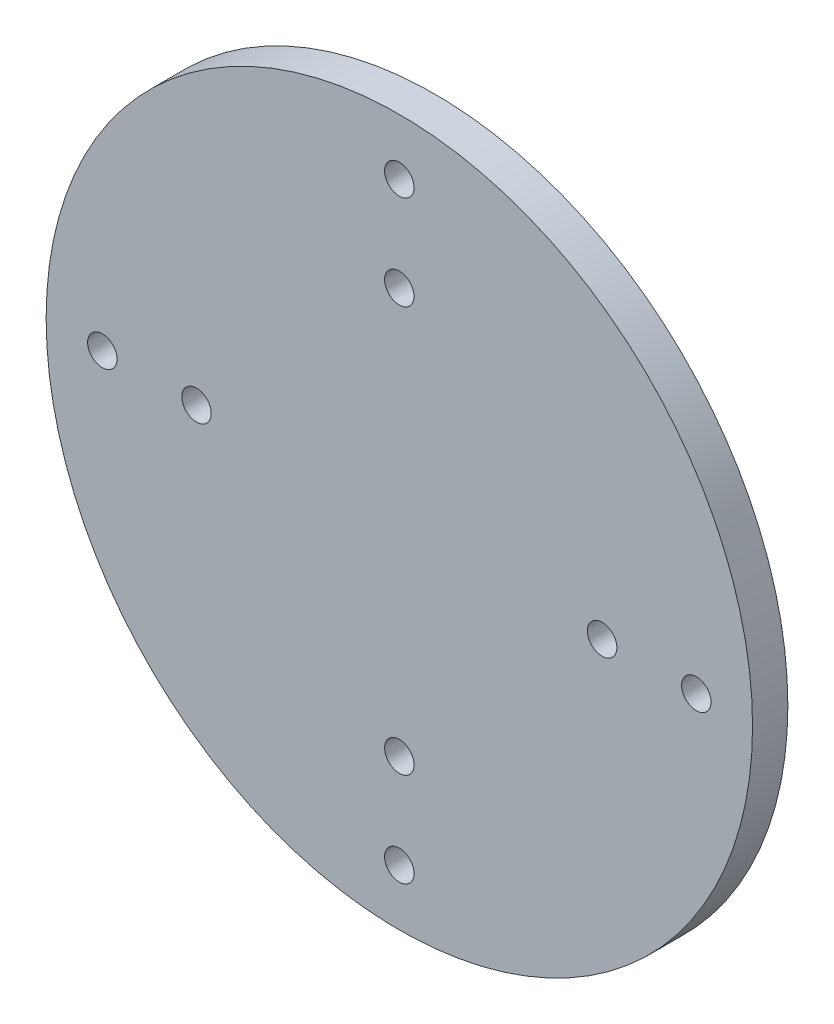
ISO-10303-21;
HEADER;
FILE_DESCRIPTION(('STEP AP214'),'2;1');
FILE_NAME('part.step','',(''),(''),'','','');
FILE_SCHEMA(('AUTOMOTIVE_DESIGN { 1 0 10303 214 1 1 1 1 }'));
ENDSEC;
DATA;
#1=APPLICATION_CONTEXT('core data for automotive mechanical design processes');
#2=APPLICATION_PROTOCOL_DEFINITION('international standard','automotive_design',2000,#1);
#3=PRODUCT_CONTEXT('',#1,'mechanical');
#4=PRODUCT('Part','Part','',(#3));
#5=PRODUCT_RELATED_PRODUCT_CATEGORY('part','',(#4));
#6=PRODUCT_DEFINITION_FORMATION('','',#4);
#7=PRODUCT_DEFINITION_CONTEXT('part definition',#1,'design');
#8=PRODUCT_DEFINITION('design','',#6,#7);
#9=PRODUCT_DEFINITION_SHAPE('','',#8);
#10=(LENGTH_UNIT() NAMED_UNIT(*) SI_UNIT(.MILLI.,.METRE.));
#11=(NAMED_UNIT(*) PLANE_ANGLE_UNIT() SI_UNIT($,.RADIAN.));
#12=(NAMED_UNIT(*) SI_UNIT($,.STERADIAN.) SOLID_ANGLE_UNIT());
#13=UNCERTAINTY_MEASURE_WITH_UNIT(LENGTH_MEASURE(1.E-05),#10,'distance_accuracy_value','');
#14=(GEOMETRIC_REPRESENTATION_CONTEXT(3) GLOBAL_UNCERTAINTY_ASSIGNED_CONTEXT((#13)) GLOBAL_UNIT_ASSIGNED_CONTEXT((#10,
#11,#12)) REPRESENTATION_CONTEXT('',''));
#15=CARTESIAN_POINT('',(0.,0.,0.));
#16=DIRECTION('',(0.,0.,1.));
#17=DIRECTION('',(1.,0.,0.));
#18=AXIS2_PLACEMENT_3D('',#15,#16,#17);
#19=CARTESIAN_POINT('',(124.757462075776,5.,0.));
#20=DIRECTION('',(0.,0.,1.));
#21=DIRECTION('',(1.,0.,0.));
#22=AXIS2_PLACEMENT_3D('',#19,#20,#21);
#23=PLANE('',#22);
#24=CARTESIAN_POINT('',(124.757462075775,-12.2246272896273,0.));
#25=DIRECTION('',(0.,0.,-1.));
#26=DIRECTION('',(-1.,0.,0.));
#27=AXIS2_PLACEMENT_3D('',#24,#25,#26);
#28=CIRCLE('',#27,1.25);
#29=CARTESIAN_POINT('',(123.507462075775,-12.2246272896273,0.));
#30=VERTEX_POINT('',#29);
#31=EDGE_CURVE('E84',#30,#30,#28,.T.);
#32=ORIENTED_EDGE('',*,*,#31,.F.);
#33=EDGE_LOOP('',(#32));
#34=FACE_BOUND('',#33,.T.);
#35=CARTESIAN_POINT('',(149.982089365403,4.99999999999999,0.));
#36=DIRECTION('',(0.,0.,-1.));
#37=DIRECTION('',(-1.,0.,0.));
#38=AXIS2_PLACEMENT_3D('',#35,#36,#37);
#39=CIRCLE('',#38,1.25);
#40=CARTESIAN_POINT('',(148.732089365403,4.99999999999999,0.));
#41=VERTEX_POINT('',#40);
#42=EDGE_CURVE('E78',#41,#41,#39,.T.);
#43=ORIENTED_EDGE('',*,*,#42,.F.);
#44=EDGE_LOOP('',(#43));
#45=FACE_BOUND('',#44,.T.);
#46=CARTESIAN_POINT('',(141.982089365403,4.99999999999999,0.));
#47=DIRECTION('',(0.,0.,-1.));
#48=DIRECTION('',(-1.,0.,0.));
#49=AXIS2_PLACEMENT_3D('',#46,#47,#48);
#50=CIRCLE('',#49,1.25);
#51=CARTESIAN_POINT('',(140.732089365403,4.99999999999999,0.));
#52=VERTEX_POINT('',#51);
#53=EDGE_CURVE('E72',#52,#52,#50,.T.);
#54=ORIENTED_EDGE('',*,*,#53,.F.);
#55=EDGE_LOOP('',(#54));
#56=FACE_BOUND('',#55,.T.);
#57=CARTESIAN_POINT('',(124.757462075776,30.2246272896273,0.));
#58=DIRECTION('',(0.,0.,-1.));
#59=DIRECTION('',(-1.,0.,0.));
#60=AXIS2_PLACEMENT_3D('',#57,#58,#59);
#61=CIRCLE('',#60,1.24999999999999);
#62=CARTESIAN_POINT('',(123.507462075776,30.2246272896273,0.));
#63=VERTEX_POINT('',#62);
#64=EDGE_CURVE('E66',#63,#63,#61,.T.);
#65=ORIENTED_EDGE('',*,*,#64,.F.);
#66=EDGE_LOOP('',(#65));
#67=FACE_BOUND('',#66,.T.);
#68=CARTESIAN_POINT('',(124.757462075776,22.2246272896273,0.));
#69=DIRECTION('',(0.,0.,-1.));
#70=DIRECTION('',(-1.,0.,0.));
#71=AXIS2_PLACEMENT_3D('',#68,#69,#70);
#72=CIRCLE('',#71,1.24999999999999);
#73=CARTESIAN_POINT('',(123.507462075776,22.2246272896273,0.));
#74=VERTEX_POINT('',#73);
#75=EDGE_CURVE('E60',#74,#74,#72,.T.);
#76=ORIENTED_EDGE('',*,*,#75,.F.);
#77=EDGE_LOOP('',(#76));
#78=FACE_BOUND('',#77,.T.);
#79=CARTESIAN_POINT('',(124.757462075776,5.,0.));
#80=DIRECTION('',(0.,0.,1.));
#81=DIRECTION('',(1.,0.,0.));
#82=AXIS2_PLACEMENT_3D('',#79,#80,#81);
#83=CIRCLE('',#82,30.);
#84=CARTESIAN_POINT('',(154.757462075776,5.,0.));
#85=VERTEX_POINT('',#84);
#86=EDGE_CURVE('E37',#85,#85,#83,.T.);
#87=ORIENTED_EDGE('',*,*,#86,.F.);
#88=EDGE_LOOP('',(#87));
#89=FACE_BOUND('',#88,.T.);
#90=CARTESIAN_POINT('',(107.532834786148,5.,0.));
#91=DIRECTION('',(0.,0.,-1.));
#92=DIRECTION('',(-1.,0.,0.));
#93=AXIS2_PLACEMENT_3D('',#90,#91,#92);
#94=CIRCLE('',#93,1.24999999999999);
#95=CARTESIAN_POINT('',(106.282834786148,5.,0.));
#96=VERTEX_POINT('',#95);
#97=EDGE_CURVE('E48',#96,#96,#94,.T.);
#98=ORIENTED_EDGE('',*,*,#97,.F.);
#99=EDGE_LOOP('',(#98));
#100=FACE_BOUND('',#99,.T.);
#101=CARTESIAN_POINT('',(99.5328347861484,5.,0.));
#102=DIRECTION('',(0.,0.,-1.));
#103=DIRECTION('',(-1.,0.,0.));
#104=AXIS2_PLACEMENT_3D('',#101,#102,#103);
#105=CIRCLE('',#104,1.24999999999999);
#106=CARTESIAN_POINT('',(98.2828347861484,5.,0.));
#107=VERTEX_POINT('',#106);
#108=EDGE_CURVE('E54',#107,#107,#105,.T.);
#109=ORIENTED_EDGE('',*,*,#108,.F.);
#110=EDGE_LOOP('',(#109));
#111=FACE_BOUND('',#110,.T.);
#112=CARTESIAN_POINT('',(124.757462075775,-20.2246272896273,0.));
#113=DIRECTION('',(0.,0.,-1.));
#114=DIRECTION('',(-1.,0.,0.));
#115=AXIS2_PLACEMENT_3D('',#112,#113,#114);
#116=CIRCLE('',#115,1.25);
#117=CARTESIAN_POINT('',(123.507462075775,-20.2246272896273,0.));
#118=VERTEX_POINT('',#117);
#119=EDGE_CURVE('E90',#118,#118,#116,.T.);
#120=ORIENTED_EDGE('',*,*,#119,.F.);
#121=EDGE_LOOP('',(#120));
#122=FACE_BOUND('',#121,.T.);
#123=ADVANCED_FACE('F33',(#34,#45,#56,#67,#78,#89,#100,#111,#122),#23,.F.);
#124=CARTESIAN_POINT('',(124.757462075776,5.,3.));
#125=DIRECTION('',(0.,0.,-1.));
#126=DIRECTION('',(-1.,0.,0.));
#127=AXIS2_PLACEMENT_3D('',#124,#125,#126);
#128=CYLINDRICAL_SURFACE('',#127,30.);
#129=CARTESIAN_POINT('',(124.757462075776,5.,3.));
#130=DIRECTION('',(0.,0.,1.));
#131=DIRECTION('',(1.,0.,0.));
#132=AXIS2_PLACEMENT_3D('',#129,#130,#131);
#133=CIRCLE('',#132,30.);
#134=CARTESIAN_POINT('',(154.757462075776,5.,3.));
#135=VERTEX_POINT('',#134);
#136=EDGE_CURVE('E10',#135,#135,#133,.T.);
#137=ORIENTED_EDGE('',*,*,#136,.F.);
#138=EDGE_LOOP('',(#137));
#139=FACE_BOUND('',#138,.T.);
#140=ORIENTED_EDGE('',*,*,#86,.T.);
#141=EDGE_LOOP('',(#140));
#142=FACE_BOUND('',#141,.T.);
#143=ADVANCED_FACE('F35',(#139,#142),#128,.T.);
#144=CARTESIAN_POINT('',(124.757462075776,5.,3.));
#145=DIRECTION('',(0.,0.,1.));
#146=DIRECTION('',(1.,0.,0.));
#147=AXIS2_PLACEMENT_3D('',#144,#145,#146);
#148=PLANE('',#147);
#149=CARTESIAN_POINT('',(124.757462075775,-20.2246272896273,3.));
#150=DIRECTION('',(0.,0.,1.));
#151=DIRECTION('',(1.,0.,0.));
#152=AXIS2_PLACEMENT_3D('',#149,#150,#151);
#153=CIRCLE('',#152,1.25);
#154=CARTESIAN_POINT('',(126.007462075775,-20.2246272896273,3.));
#155=VERTEX_POINT('',#154);
#156=EDGE_CURVE('E87',#155,#155,#153,.T.);
#157=ORIENTED_EDGE('',*,*,#156,.F.);
#158=EDGE_LOOP('',(#157));
#159=FACE_BOUND('',#158,.T.);
#160=CARTESIAN_POINT('',(124.757462075775,-12.2246272896273,3.));
#161=DIRECTION('',(0.,0.,1.));
#162=DIRECTION('',(1.,0.,0.));
#163=AXIS2_PLACEMENT_3D('',#160,#161,#162);
#164=CIRCLE('',#163,1.25);
#165=CARTESIAN_POINT('',(126.007462075775,-12.2246272896273,3.));
#166=VERTEX_POINT('',#165);
#167=EDGE_CURVE('E81',#166,#166,#164,.T.);
#168=ORIENTED_EDGE('',*,*,#167,.F.);
#169=EDGE_LOOP('',(#168));
#170=FACE_BOUND('',#169,.T.);
#171=CARTESIAN_POINT('',(149.982089365403,4.99999999999999,3.));
#172=DIRECTION('',(0.,0.,1.));
#173=DIRECTION('',(1.,0.,0.));
#174=AXIS2_PLACEMENT_3D('',#171,#172,#173);
#175=CIRCLE('',#174,1.25);
#176=CARTESIAN_POINT('',(151.232089365403,4.99999999999999,3.));
#177=VERTEX_POINT('',#176);
#178=EDGE_CURVE('E75',#177,#177,#175,.T.);
#179=ORIENTED_EDGE('',*,*,#178,.F.);
#180=EDGE_LOOP('',(#179));
#181=FACE_BOUND('',#180,.T.);
#182=CARTESIAN_POINT('',(141.982089365403,4.99999999999999,3.));
#183=DIRECTION('',(0.,0.,1.));
#184=DIRECTION('',(1.,0.,0.));
#185=AXIS2_PLACEMENT_3D('',#182,#183,#184);
#186=CIRCLE('',#185,1.25);
#187=CARTESIAN_POINT('',(143.232089365403,4.99999999999999,3.));
#188=VERTEX_POINT('',#187);
#189=EDGE_CURVE('E69',#188,#188,#186,.T.);
#190=ORIENTED_EDGE('',*,*,#189,.F.);
#191=EDGE_LOOP('',(#190));
#192=FACE_BOUND('',#191,.T.);
#193=CARTESIAN_POINT('',(124.757462075776,30.2246272896273,3.));
#194=DIRECTION('',(0.,0.,1.));
#195=DIRECTION('',(1.,0.,0.));
#196=AXIS2_PLACEMENT_3D('',#193,#194,#195);
#197=CIRCLE('',#196,1.24999999999999);
#198=CARTESIAN_POINT('',(126.007462075776,30.2246272896273,3.));
#199=VERTEX_POINT('',#198);
#200=EDGE_CURVE('E63',#199,#199,#197,.T.);
#201=ORIENTED_EDGE('',*,*,#200,.F.);
#202=EDGE_LOOP('',(#201));
#203=FACE_BOUND('',#202,.T.);
#204=CARTESIAN_POINT('',(124.757462075776,22.2246272896273,3.));
#205=DIRECTION('',(0.,0.,1.));
#206=DIRECTION('',(1.,0.,0.));
#207=AXIS2_PLACEMENT_3D('',#204,#205,#206);
#208=CIRCLE('',#207,1.24999999999999);
#209=CARTESIAN_POINT('',(126.007462075776,22.2246272896273,3.));
#210=VERTEX_POINT('',#209);
#211=EDGE_CURVE('E57',#210,#210,#208,.T.);
#212=ORIENTED_EDGE('',*,*,#211,.F.);
#213=EDGE_LOOP('',(#212));
#214=FACE_BOUND('',#213,.T.);
#215=CARTESIAN_POINT('',(99.5328347861484,5.,3.));
#216=DIRECTION('',(0.,0.,1.));
#217=DIRECTION('',(1.,0.,0.));
#218=AXIS2_PLACEMENT_3D('',#215,#216,#217);
#219=CIRCLE('',#218,1.24999999999999);
#220=CARTESIAN_POINT('',(100.782834786148,5.,3.));
#221=VERTEX_POINT('',#220);
#222=EDGE_CURVE('E51',#221,#221,#219,.T.);
#223=ORIENTED_EDGE('',*,*,#222,.F.);
#224=EDGE_LOOP('',(#223));
#225=FACE_BOUND('',#224,.T.);
#226=CARTESIAN_POINT('',(107.532834786148,5.,3.));
#227=DIRECTION('',(0.,0.,1.));
#228=DIRECTION('',(1.,0.,0.));
#229=AXIS2_PLACEMENT_3D('',#226,#227,#228);
#230=CIRCLE('',#229,1.24999999999999);
#231=CARTESIAN_POINT('',(108.782834786148,5.,3.));
#232=VERTEX_POINT('',#231);
#233=EDGE_CURVE('E44',#232,#232,#230,.T.);
#234=ORIENTED_EDGE('',*,*,#233,.F.);
#235=EDGE_LOOP('',(#234));
#236=FACE_BOUND('',#235,.T.);
#237=ORIENTED_EDGE('',*,*,#136,.T.);
#238=EDGE_LOOP('',(#237));
#239=FACE_BOUND('',#238,.T.);
#240=ADVANCED_FACE('F103',(#159,#170,#181,#192,#203,#214,#225,#236,#239),#148,.T.);
#241=CARTESIAN_POINT('',(107.532834786148,5.,0.));
#242=DIRECTION('',(0.,0.,-1.));
#243=DIRECTION('',(-1.,0.,0.));
#244=AXIS2_PLACEMENT_3D('',#241,#242,#243);
#245=CYLINDRICAL_SURFACE('',#244,1.24999999999999);
#246=ORIENTED_EDGE('',*,*,#233,.T.);
#247=EDGE_LOOP('',(#246));
#248=FACE_BOUND('',#247,.T.);
#249=ORIENTED_EDGE('',*,*,#97,.T.);
#250=EDGE_LOOP('',(#249));
#251=FACE_BOUND('',#250,.T.);
#252=ADVANCED_FACE('F109',(#248,#251),#245,.F.);
#253=CARTESIAN_POINT('',(99.5328347861484,5.,0.));
#254=DIRECTION('',(0.,0.,-1.));
#255=DIRECTION('',(-1.,0.,0.));
#256=AXIS2_PLACEMENT_3D('',#253,#254,#255);
#257=CYLINDRICAL_SURFACE('',#256,1.24999999999999);
#258=ORIENTED_EDGE('',*,*,#222,.T.);
#259=EDGE_LOOP('',(#258));
#260=FACE_BOUND('',#259,.T.);
#261=ORIENTED_EDGE('',*,*,#108,.T.);
#262=EDGE_LOOP('',(#261));
#263=FACE_BOUND('',#262,.T.);
#264=ADVANCED_FACE('F113',(#260,#263),#257,.F.);
#265=CARTESIAN_POINT('',(124.757462075776,22.2246272896273,0.));
#266=DIRECTION('',(0.,0.,-1.));
#267=DIRECTION('',(-1.,0.,0.));
#268=AXIS2_PLACEMENT_3D('',#265,#266,#267);
#269=CYLINDRICAL_SURFACE('',#268,1.24999999999999);
#270=ORIENTED_EDGE('',*,*,#211,.T.);
#271=EDGE_LOOP('',(#270));
#272=FACE_BOUND('',#271,.T.);
#273=ORIENTED_EDGE('',*,*,#75,.T.);
#274=EDGE_LOOP('',(#273));
#275=FACE_BOUND('',#274,.T.);
#276=ADVANCED_FACE('F117',(#272,#275),#269,.F.);
#277=CARTESIAN_POINT('',(124.757462075776,30.2246272896273,0.));
#278=DIRECTION('',(0.,0.,-1.));
#279=DIRECTION('',(-1.,0.,0.));
#280=AXIS2_PLACEMENT_3D('',#277,#278,#279);
#281=CYLINDRICAL_SURFACE('',#280,1.24999999999999);
#282=ORIENTED_EDGE('',*,*,#200,.T.);
#283=EDGE_LOOP('',(#282));
#284=FACE_BOUND('',#283,.T.);
#285=ORIENTED_EDGE('',*,*,#64,.T.);
#286=EDGE_LOOP('',(#285));
#287=FACE_BOUND('',#286,.T.);
#288=ADVANCED_FACE('F121',(#284,#287),#281,.F.);
#289=CARTESIAN_POINT('',(141.982089365403,4.99999999999999,0.));
#290=DIRECTION('',(0.,0.,-1.));
#291=DIRECTION('',(-1.,0.,0.));
#292=AXIS2_PLACEMENT_3D('',#289,#290,#291);
#293=CYLINDRICAL_SURFACE('',#292,1.25);
#294=ORIENTED_EDGE('',*,*,#189,.T.);
#295=EDGE_LOOP('',(#294));
#296=FACE_BOUND('',#295,.T.);
#297=ORIENTED_EDGE('',*,*,#53,.T.);
#298=EDGE_LOOP('',(#297));
#299=FACE_BOUND('',#298,.T.);
#300=ADVANCED_FACE('F125',(#296,#299),#293,.F.);
#301=CARTESIAN_POINT('',(149.982089365403,4.99999999999999,0.));
#302=DIRECTION('',(0.,0.,-1.));
#303=DIRECTION('',(-1.,0.,0.));
#304=AXIS2_PLACEMENT_3D('',#301,#302,#303);
#305=CYLINDRICAL_SURFACE('',#304,1.25);
#306=ORIENTED_EDGE('',*,*,#178,.T.);
#307=EDGE_LOOP('',(#306));
#308=FACE_BOUND('',#307,.T.);
#309=ORIENTED_EDGE('',*,*,#42,.T.);
#310=EDGE_LOOP('',(#309));
#311=FACE_BOUND('',#310,.T.);
#312=ADVANCED_FACE('F129',(#308,#311),#305,.F.);
#313=CARTESIAN_POINT('',(124.757462075775,-12.2246272896273,0.));
#314=DIRECTION('',(0.,0.,-1.));
#315=DIRECTION('',(-1.,0.,0.));
#316=AXIS2_PLACEMENT_3D('',#313,#314,#315);
#317=CYLINDRICAL_SURFACE('',#316,1.25);
#318=ORIENTED_EDGE('',*,*,#167,.T.);
#319=EDGE_LOOP('',(#318));
#320=FACE_BOUND('',#319,.T.);
#321=ORIENTED_EDGE('',*,*,#31,.T.);
#322=EDGE_LOOP('',(#321));
#323=FACE_BOUND('',#322,.T.);
#324=ADVANCED_FACE('F133',(#320,#323),#317,.F.);
#325=CARTESIAN_POINT('',(124.757462075775,-20.2246272896273,0.));
#326=DIRECTION('',(0.,0.,-1.));
#327=DIRECTION('',(-1.,0.,0.));
#328=AXIS2_PLACEMENT_3D('',#325,#326,#327);
#329=CYLINDRICAL_SURFACE('',#328,1.25);
#330=ORIENTED_EDGE('',*,*,#156,.T.);
#331=EDGE_LOOP('',(#330));
#332=FACE_BOUND('',#331,.T.);
#333=ORIENTED_EDGE('',*,*,#119,.T.);
#334=EDGE_LOOP('',(#333));
#335=FACE_BOUND('',#334,.T.);
#336=ADVANCED_FACE('F94',(#332,#335),#329,.F.);
#337=CLOSED_SHELL('',(#123,#143,#240,#252,#264,#276,#288,#300,#312,#324,#336));
#338=MANIFOLD_SOLID_BREP('B2',#337);
#339=ADVANCED_BREP_SHAPE_REPRESENTATION('',(#18,#338),#14);
#340=SHAPE_DEFINITION_REPRESENTATION(#9,#339);
ENDSEC;
END-ISO-10303-21;
